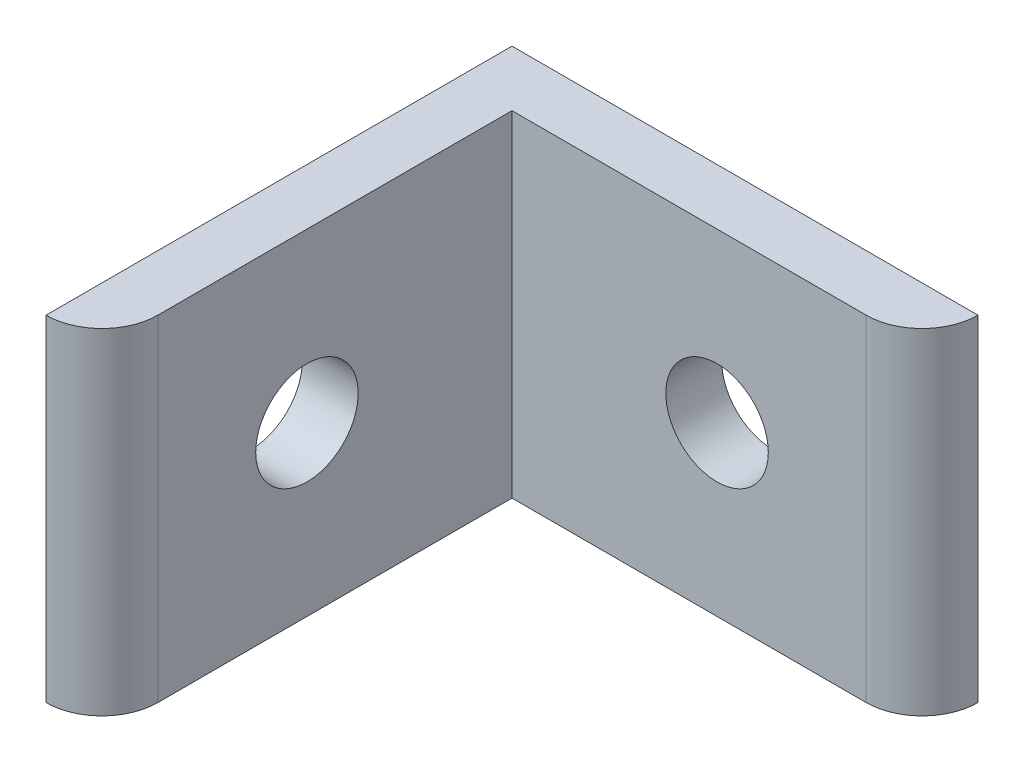
ISO-10303-21;
HEADER;
FILE_DESCRIPTION(('STEP AP214'),'2;1');
FILE_NAME('part.step','',(''),(''),'','','');
FILE_SCHEMA(('AUTOMOTIVE_DESIGN { 1 0 10303 214 1 1 1 1 }'));
ENDSEC;
DATA;
#1=APPLICATION_CONTEXT('core data for automotive mechanical design processes');
#2=APPLICATION_PROTOCOL_DEFINITION('international standard','automotive_design',2000,#1);
#3=PRODUCT_CONTEXT('',#1,'mechanical');
#4=PRODUCT('Part','Part','',(#3));
#5=PRODUCT_RELATED_PRODUCT_CATEGORY('part','',(#4));
#6=PRODUCT_DEFINITION_FORMATION('','',#4);
#7=PRODUCT_DEFINITION_CONTEXT('part definition',#1,'design');
#8=PRODUCT_DEFINITION('design','',#6,#7);
#9=PRODUCT_DEFINITION_SHAPE('','',#8);
#10=(LENGTH_UNIT() NAMED_UNIT(*) SI_UNIT(.MILLI.,.METRE.));
#11=(NAMED_UNIT(*) PLANE_ANGLE_UNIT() SI_UNIT($,.RADIAN.));
#12=(NAMED_UNIT(*) SI_UNIT($,.STERADIAN.) SOLID_ANGLE_UNIT());
#13=UNCERTAINTY_MEASURE_WITH_UNIT(LENGTH_MEASURE(1.E-05),#10,'distance_accuracy_value','');
#14=(GEOMETRIC_REPRESENTATION_CONTEXT(3) GLOBAL_UNCERTAINTY_ASSIGNED_CONTEXT((#13)) GLOBAL_UNIT_ASSIGNED_CONTEXT((#10,
#11,#12)) REPRESENTATION_CONTEXT('',''));
#15=CARTESIAN_POINT('',(0.,0.,0.));
#16=DIRECTION('',(0.,0.,1.));
#17=DIRECTION('',(1.,0.,0.));
#18=AXIS2_PLACEMENT_3D('',#15,#16,#17);
#19=CARTESIAN_POINT('',(0.,18.,0.));
#20=DIRECTION('',(0.,0.,1.));
#21=DIRECTION('',(1.,0.,0.));
#22=AXIS2_PLACEMENT_3D('',#19,#20,#21);
#23=PLANE('',#22);
#24=CARTESIAN_POINT('',(14.,9.,0.));
#25=DIRECTION('',(0.,0.,1.));
#26=DIRECTION('',(1.,0.,0.));
#27=AXIS2_PLACEMENT_3D('',#24,#25,#26);
#28=CIRCLE('',#27,2.75);
#29=CARTESIAN_POINT('',(16.75,9.,0.));
#30=VERTEX_POINT('',#29);
#31=EDGE_CURVE('E163',#30,#30,#28,.T.);
#32=ORIENTED_EDGE('',*,*,#31,.T.);
#33=EDGE_LOOP('',(#32));
#34=FACE_BOUND('',#33,.T.);
#35=DIRECTION('',(-1.,0.,0.));
#36=VECTOR('',#35,1.);
#37=CARTESIAN_POINT('',(0.,0.,0.));
#38=LINE('',#37,#36);
#39=CARTESIAN_POINT('',(25.,0.,0.));
#40=VERTEX_POINT('',#39);
#41=CARTESIAN_POINT('',(0.,0.,0.));
#42=VERTEX_POINT('',#41);
#43=EDGE_CURVE('E124',#40,#42,#38,.T.);
#44=ORIENTED_EDGE('',*,*,#43,.T.);
#45=DIRECTION('',(0.,-1.,0.));
#46=VECTOR('',#45,1.);
#47=CARTESIAN_POINT('',(0.,18.,0.));
#48=LINE('',#47,#46);
#49=CARTESIAN_POINT('',(0.,18.,0.));
#50=VERTEX_POINT('',#49);
#51=EDGE_CURVE('E104',#50,#42,#48,.T.);
#52=ORIENTED_EDGE('',*,*,#51,.F.);
#53=DIRECTION('',(-1.,0.,0.));
#54=VECTOR('',#53,1.);
#55=CARTESIAN_POINT('',(0.,18.,0.));
#56=LINE('',#55,#54);
#57=CARTESIAN_POINT('',(25.,18.,0.));
#58=VERTEX_POINT('',#57);
#59=EDGE_CURVE('E112',#58,#50,#56,.T.);
#60=ORIENTED_EDGE('',*,*,#59,.F.);
#61=DIRECTION('',(0.,-1.,0.));
#62=VECTOR('',#61,1.);
#63=CARTESIAN_POINT('',(25.,18.,0.));
#64=LINE('',#63,#62);
#65=EDGE_CURVE('E169',#58,#40,#64,.T.);
#66=ORIENTED_EDGE('',*,*,#65,.T.);
#67=EDGE_LOOP('',(#44,#52,#60,#66));
#68=FACE_BOUND('',#67,.T.);
#69=ADVANCED_FACE('F45',(#34,#68),#23,.F.);
#70=CARTESIAN_POINT('',(0.,18.,0.));
#71=DIRECTION('',(1.,0.,0.));
#72=DIRECTION('',(0.,0.,-1.));
#73=AXIS2_PLACEMENT_3D('',#70,#71,#72);
#74=PLANE('',#73);
#75=CARTESIAN_POINT('',(0.,9.,14.));
#76=DIRECTION('',(-1.,0.,0.));
#77=DIRECTION('',(0.,0.,1.));
#78=AXIS2_PLACEMENT_3D('',#75,#76,#77);
#79=CIRCLE('',#78,2.75);
#80=CARTESIAN_POINT('',(0.,9.,16.75));
#81=VERTEX_POINT('',#80);
#82=EDGE_CURVE('E179',#81,#81,#79,.T.);
#83=ORIENTED_EDGE('',*,*,#82,.F.);
#84=EDGE_LOOP('',(#83));
#85=FACE_BOUND('',#84,.T.);
#86=DIRECTION('',(0.,0.,1.));
#87=VECTOR('',#86,1.);
#88=CARTESIAN_POINT('',(0.,0.,0.));
#89=LINE('',#88,#87);
#90=CARTESIAN_POINT('',(0.,0.,25.));
#91=VERTEX_POINT('',#90);
#92=EDGE_CURVE('E156',#42,#91,#89,.T.);
#93=ORIENTED_EDGE('',*,*,#92,.T.);
#94=DIRECTION('',(0.,-1.,0.));
#95=VECTOR('',#94,1.);
#96=CARTESIAN_POINT('',(0.,18.,25.));
#97=LINE('',#96,#95);
#98=CARTESIAN_POINT('',(0.,18.,25.));
#99=VERTEX_POINT('',#98);
#100=EDGE_CURVE('E107',#99,#91,#97,.T.);
#101=ORIENTED_EDGE('',*,*,#100,.F.);
#102=DIRECTION('',(0.,0.,1.));
#103=VECTOR('',#102,1.);
#104=CARTESIAN_POINT('',(0.,18.,0.));
#105=LINE('',#104,#103);
#106=EDGE_CURVE('E99',#50,#99,#105,.T.);
#107=ORIENTED_EDGE('',*,*,#106,.F.);
#108=ORIENTED_EDGE('',*,*,#51,.T.);
#109=EDGE_LOOP('',(#93,#101,#107,#108));
#110=FACE_BOUND('',#109,.T.);
#111=ADVANCED_FACE('F102',(#85,#110),#74,.F.);
#112=CARTESIAN_POINT('',(3.,18.,3.));
#113=DIRECTION('',(-1.,0.,0.));
#114=DIRECTION('',(0.,0.,1.));
#115=AXIS2_PLACEMENT_3D('',#112,#113,#114);
#116=PLANE('',#115);
#117=CARTESIAN_POINT('',(2.99999999999995,9.,14.));
#118=DIRECTION('',(-1.,0.,0.));
#119=DIRECTION('',(0.,0.,1.));
#120=AXIS2_PLACEMENT_3D('',#117,#118,#119);
#121=CIRCLE('',#120,2.75);
#122=CARTESIAN_POINT('',(2.99999999999994,9.,16.75));
#123=VERTEX_POINT('',#122);
#124=EDGE_CURVE('E183',#123,#123,#121,.T.);
#125=ORIENTED_EDGE('',*,*,#124,.T.);
#126=EDGE_LOOP('',(#125));
#127=FACE_BOUND('',#126,.T.);
#128=DIRECTION('',(0.,0.,-1.));
#129=VECTOR('',#128,1.);
#130=CARTESIAN_POINT('',(3.,18.,3.));
#131=LINE('',#130,#129);
#132=CARTESIAN_POINT('',(3.,18.,22.));
#133=VERTEX_POINT('',#132);
#134=CARTESIAN_POINT('',(3.,18.,3.));
#135=VERTEX_POINT('',#134);
#136=EDGE_CURVE('E111',#133,#135,#131,.T.);
#137=ORIENTED_EDGE('',*,*,#136,.F.);
#138=DIRECTION('',(0.,-1.,0.));
#139=VECTOR('',#138,1.);
#140=CARTESIAN_POINT('',(3.,18.,22.));
#141=LINE('',#140,#139);
#142=CARTESIAN_POINT('',(3.,0.,22.));
#143=VERTEX_POINT('',#142);
#144=EDGE_CURVE('E126',#133,#143,#141,.T.);
#145=ORIENTED_EDGE('',*,*,#144,.T.);
#146=DIRECTION('',(0.,0.,-1.));
#147=VECTOR('',#146,1.);
#148=CARTESIAN_POINT('',(3.,0.,3.));
#149=LINE('',#148,#147);
#150=CARTESIAN_POINT('',(3.,0.,3.));
#151=VERTEX_POINT('',#150);
#152=EDGE_CURVE('E157',#143,#151,#149,.T.);
#153=ORIENTED_EDGE('',*,*,#152,.T.);
#154=DIRECTION('',(0.,-1.,0.));
#155=VECTOR('',#154,1.);
#156=CARTESIAN_POINT('',(3.,18.,3.));
#157=LINE('',#156,#155);
#158=EDGE_CURVE('E132',#135,#151,#157,.T.);
#159=ORIENTED_EDGE('',*,*,#158,.F.);
#160=EDGE_LOOP('',(#137,#145,#153,#159));
#161=FACE_BOUND('',#160,.T.);
#162=ADVANCED_FACE('F148',(#127,#161),#116,.F.);
#163=CARTESIAN_POINT('',(25.,18.,3.));
#164=DIRECTION('',(0.,0.,-1.));
#165=DIRECTION('',(-1.,0.,0.));
#166=AXIS2_PLACEMENT_3D('',#163,#164,#165);
#167=PLANE('',#166);
#168=CARTESIAN_POINT('',(14.,9.,3.));
#169=DIRECTION('',(0.,0.,1.));
#170=DIRECTION('',(1.,0.,0.));
#171=AXIS2_PLACEMENT_3D('',#168,#169,#170);
#172=CIRCLE('',#171,2.75);
#173=CARTESIAN_POINT('',(16.75,9.,3.));
#174=VERTEX_POINT('',#173);
#175=EDGE_CURVE('E175',#174,#174,#172,.T.);
#176=ORIENTED_EDGE('',*,*,#175,.F.);
#177=EDGE_LOOP('',(#176));
#178=FACE_BOUND('',#177,.T.);
#179=DIRECTION('',(1.,0.,0.));
#180=VECTOR('',#179,1.);
#181=CARTESIAN_POINT('',(25.,0.,3.));
#182=LINE('',#181,#180);
#183=CARTESIAN_POINT('',(22.,0.,3.));
#184=VERTEX_POINT('',#183);
#185=EDGE_CURVE('E122',#151,#184,#182,.T.);
#186=ORIENTED_EDGE('',*,*,#185,.T.);
#187=DIRECTION('',(0.,-1.,0.));
#188=VECTOR('',#187,1.);
#189=CARTESIAN_POINT('',(22.,18.,3.));
#190=LINE('',#189,#188);
#191=CARTESIAN_POINT('',(22.,18.,3.));
#192=VERTEX_POINT('',#191);
#193=EDGE_CURVE('E11',#184,#192,#190,.F.);
#194=ORIENTED_EDGE('',*,*,#193,.T.);
#195=DIRECTION('',(1.,0.,0.));
#196=VECTOR('',#195,1.);
#197=CARTESIAN_POINT('',(25.,18.,3.));
#198=LINE('',#197,#196);
#199=EDGE_CURVE('E152',#135,#192,#198,.T.);
#200=ORIENTED_EDGE('',*,*,#199,.F.);
#201=ORIENTED_EDGE('',*,*,#158,.T.);
#202=EDGE_LOOP('',(#186,#194,#200,#201));
#203=FACE_BOUND('',#202,.T.);
#204=ADVANCED_FACE('F172',(#178,#203),#167,.F.);
#205=CARTESIAN_POINT('',(0.,18.,0.));
#206=DIRECTION('',(0.,-1.,0.));
#207=DIRECTION('',(0.,0.,-1.));
#208=AXIS2_PLACEMENT_3D('',#205,#206,#207);
#209=PLANE('',#208);
#210=ORIENTED_EDGE('',*,*,#106,.T.);
#211=CARTESIAN_POINT('',(0.,18.,22.));
#212=DIRECTION('',(0.,-1.,0.));
#213=DIRECTION('',(0.,0.,-1.));
#214=AXIS2_PLACEMENT_3D('',#211,#212,#213);
#215=CIRCLE('',#214,3.);
#216=EDGE_CURVE('E54',#99,#133,#215,.F.);
#217=ORIENTED_EDGE('',*,*,#216,.T.);
#218=ORIENTED_EDGE('',*,*,#136,.T.);
#219=ORIENTED_EDGE('',*,*,#199,.T.);
#220=CARTESIAN_POINT('',(22.,18.,0.));
#221=DIRECTION('',(0.,-1.,0.));
#222=DIRECTION('',(0.,0.,-1.));
#223=AXIS2_PLACEMENT_3D('',#220,#221,#222);
#224=CIRCLE('',#223,3.);
#225=EDGE_CURVE('E117',#192,#58,#224,.F.);
#226=ORIENTED_EDGE('',*,*,#225,.T.);
#227=ORIENTED_EDGE('',*,*,#59,.T.);
#228=EDGE_LOOP('',(#210,#217,#218,#219,#226,#227));
#229=FACE_BOUND('',#228,.T.);
#230=ADVANCED_FACE('F115',(#229),#209,.F.);
#231=CARTESIAN_POINT('',(0.,0.,0.));
#232=DIRECTION('',(0.,-1.,0.));
#233=DIRECTION('',(0.,0.,-1.));
#234=AXIS2_PLACEMENT_3D('',#231,#232,#233);
#235=PLANE('',#234);
#236=ORIENTED_EDGE('',*,*,#152,.F.);
#237=CARTESIAN_POINT('',(0.,0.,22.));
#238=DIRECTION('',(0.,-1.,0.));
#239=DIRECTION('',(0.,0.,-1.));
#240=AXIS2_PLACEMENT_3D('',#237,#238,#239);
#241=CIRCLE('',#240,3.);
#242=EDGE_CURVE('E138',#143,#91,#241,.T.);
#243=ORIENTED_EDGE('',*,*,#242,.T.);
#244=ORIENTED_EDGE('',*,*,#92,.F.);
#245=ORIENTED_EDGE('',*,*,#43,.F.);
#246=CARTESIAN_POINT('',(22.,0.,0.));
#247=DIRECTION('',(0.,-1.,0.));
#248=DIRECTION('',(0.,0.,-1.));
#249=AXIS2_PLACEMENT_3D('',#246,#247,#248);
#250=CIRCLE('',#249,3.);
#251=EDGE_CURVE('E67',#40,#184,#250,.T.);
#252=ORIENTED_EDGE('',*,*,#251,.T.);
#253=ORIENTED_EDGE('',*,*,#185,.F.);
#254=EDGE_LOOP('',(#236,#243,#244,#245,#252,#253));
#255=FACE_BOUND('',#254,.T.);
#256=ADVANCED_FACE('F155',(#255),#235,.T.);
#257=CARTESIAN_POINT('',(14.,9.,0.));
#258=DIRECTION('',(0.,0.,1.));
#259=DIRECTION('',(1.,0.,0.));
#260=AXIS2_PLACEMENT_3D('',#257,#258,#259);
#261=CYLINDRICAL_SURFACE('',#260,2.75);
#262=ORIENTED_EDGE('',*,*,#31,.F.);
#263=EDGE_LOOP('',(#262));
#264=FACE_BOUND('',#263,.T.);
#265=ORIENTED_EDGE('',*,*,#175,.T.);
#266=EDGE_LOOP('',(#265));
#267=FACE_BOUND('',#266,.T.);
#268=ADVANCED_FACE('F212',(#264,#267),#261,.F.);
#269=CARTESIAN_POINT('',(0.,9.,14.));
#270=DIRECTION('',(1.,0.,0.));
#271=DIRECTION('',(0.,0.,-1.));
#272=AXIS2_PLACEMENT_3D('',#269,#270,#271);
#273=CYLINDRICAL_SURFACE('',#272,2.75);
#274=ORIENTED_EDGE('',*,*,#82,.T.);
#275=EDGE_LOOP('',(#274));
#276=FACE_BOUND('',#275,.T.);
#277=ORIENTED_EDGE('',*,*,#124,.F.);
#278=EDGE_LOOP('',(#277));
#279=FACE_BOUND('',#278,.T.);
#280=ADVANCED_FACE('F191',(#276,#279),#273,.F.);
#281=CARTESIAN_POINT('',(0.,18.,22.));
#282=DIRECTION('',(0.,-1.,0.));
#283=DIRECTION('',(0.,0.,-1.));
#284=AXIS2_PLACEMENT_3D('',#281,#282,#283);
#285=CYLINDRICAL_SURFACE('',#284,3.);
#286=ORIENTED_EDGE('',*,*,#216,.F.);
#287=ORIENTED_EDGE('',*,*,#100,.T.);
#288=ORIENTED_EDGE('',*,*,#242,.F.);
#289=ORIENTED_EDGE('',*,*,#144,.F.);
#290=EDGE_LOOP('',(#286,#287,#288,#289));
#291=FACE_BOUND('',#290,.T.);
#292=ADVANCED_FACE('F154',(#291),#285,.T.);
#293=CARTESIAN_POINT('',(22.,18.,0.));
#294=DIRECTION('',(0.,-1.,0.));
#295=DIRECTION('',(0.,0.,-1.));
#296=AXIS2_PLACEMENT_3D('',#293,#294,#295);
#297=CYLINDRICAL_SURFACE('',#296,3.);
#298=ORIENTED_EDGE('',*,*,#225,.F.);
#299=ORIENTED_EDGE('',*,*,#193,.F.);
#300=ORIENTED_EDGE('',*,*,#251,.F.);
#301=ORIENTED_EDGE('',*,*,#65,.F.);
#302=EDGE_LOOP('',(#298,#299,#300,#301));
#303=FACE_BOUND('',#302,.T.);
#304=ADVANCED_FACE('F47',(#303),#297,.T.);
#305=CLOSED_SHELL('',(#69,#111,#162,#204,#230,#256,#268,#280,#292,#304));
#306=MANIFOLD_SOLID_BREP('B2',#305);
#307=ADVANCED_BREP_SHAPE_REPRESENTATION('',(#18,#306),#14);
#308=SHAPE_DEFINITION_REPRESENTATION(#9,#307);
ENDSEC;
END-ISO-10303-21;
